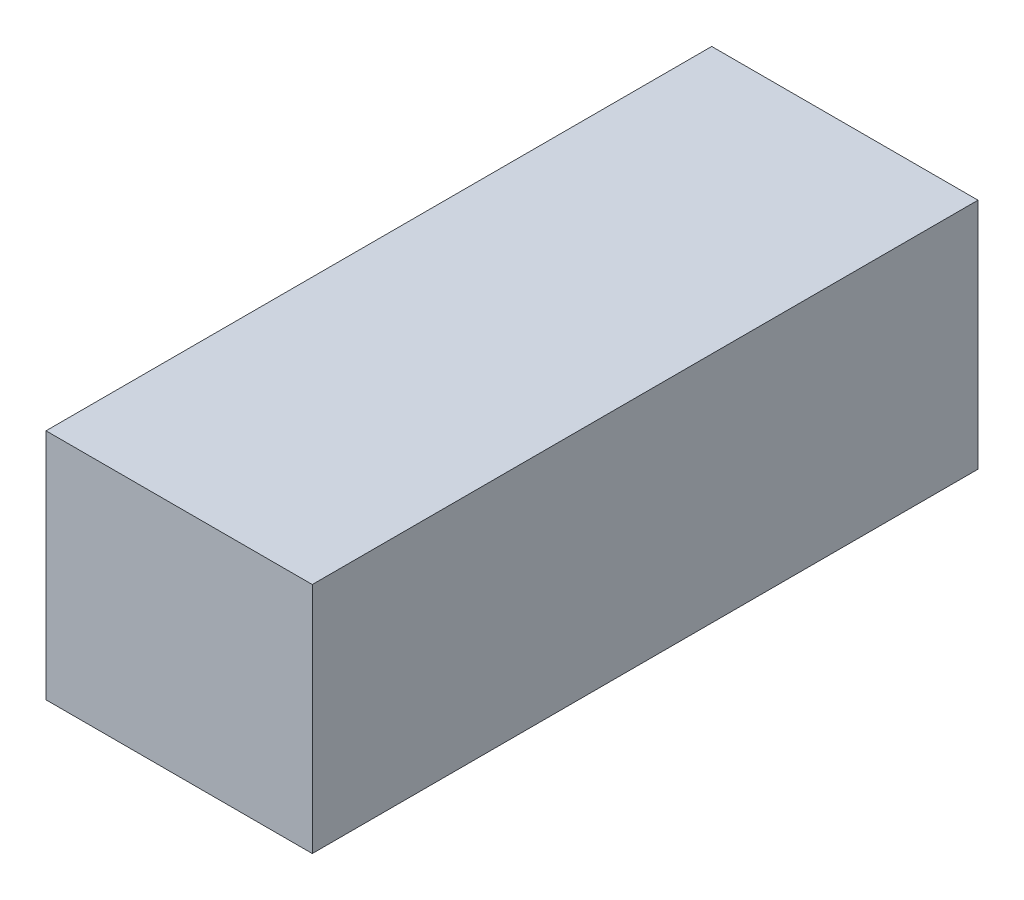
ISO-10303-21;
HEADER;
FILE_DESCRIPTION(('STEP AP214'),'2;1');
FILE_NAME('part.step','',(''),(''),'','','');
FILE_SCHEMA(('AUTOMOTIVE_DESIGN { 1 0 10303 214 1 1 1 1 }'));
ENDSEC;
DATA;
#1=APPLICATION_CONTEXT('core data for automotive mechanical design processes');
#2=APPLICATION_PROTOCOL_DEFINITION('international standard','automotive_design',2000,#1);
#3=PRODUCT_CONTEXT('',#1,'mechanical');
#4=PRODUCT('Part','Part','',(#3));
#5=PRODUCT_RELATED_PRODUCT_CATEGORY('part','',(#4));
#6=PRODUCT_DEFINITION_FORMATION('','',#4);
#7=PRODUCT_DEFINITION_CONTEXT('part definition',#1,'design');
#8=PRODUCT_DEFINITION('design','',#6,#7);
#9=PRODUCT_DEFINITION_SHAPE('','',#8);
#10=(LENGTH_UNIT() NAMED_UNIT(*) SI_UNIT(.MILLI.,.METRE.));
#11=(NAMED_UNIT(*) PLANE_ANGLE_UNIT() SI_UNIT($,.RADIAN.));
#12=(NAMED_UNIT(*) SI_UNIT($,.STERADIAN.) SOLID_ANGLE_UNIT());
#13=UNCERTAINTY_MEASURE_WITH_UNIT(LENGTH_MEASURE(1.E-05),#10,'distance_accuracy_value','');
#14=(GEOMETRIC_REPRESENTATION_CONTEXT(3) GLOBAL_UNCERTAINTY_ASSIGNED_CONTEXT((#13)) GLOBAL_UNIT_ASSIGNED_CONTEXT((#10,
#11,#12)) REPRESENTATION_CONTEXT('',''));
#15=CARTESIAN_POINT('',(0.,0.,0.));
#16=DIRECTION('',(0.,0.,1.));
#17=DIRECTION('',(1.,0.,0.));
#18=AXIS2_PLACEMENT_3D('',#15,#16,#17);
#19=CARTESIAN_POINT('',(2.,-1.75,10.));
#20=DIRECTION('',(-1.,0.,0.));
#21=DIRECTION('',(0.,0.,1.));
#22=AXIS2_PLACEMENT_3D('',#19,#20,#21);
#23=PLANE('',#22);
#24=DIRECTION('',(0.,1.,0.));
#25=VECTOR('',#24,1.);
#26=CARTESIAN_POINT('',(2.,-1.75,0.));
#27=LINE('',#26,#25);
#28=CARTESIAN_POINT('',(2.,-1.75,0.));
#29=VERTEX_POINT('',#28);
#30=CARTESIAN_POINT('',(2.,1.75,0.));
#31=VERTEX_POINT('',#30);
#32=EDGE_CURVE('E107',#29,#31,#27,.T.);
#33=ORIENTED_EDGE('',*,*,#32,.T.);
#34=DIRECTION('',(0.,0.,-1.));
#35=VECTOR('',#34,1.);
#36=CARTESIAN_POINT('',(2.,1.75,10.));
#37=LINE('',#36,#35);
#38=CARTESIAN_POINT('',(2.,1.75,10.));
#39=VERTEX_POINT('',#38);
#40=EDGE_CURVE('E11',#39,#31,#37,.T.);
#41=ORIENTED_EDGE('',*,*,#40,.F.);
#42=DIRECTION('',(0.,1.,0.));
#43=VECTOR('',#42,1.);
#44=CARTESIAN_POINT('',(2.,-1.75,10.));
#45=LINE('',#44,#43);
#46=CARTESIAN_POINT('',(2.,-1.75,10.));
#47=VERTEX_POINT('',#46);
#48=EDGE_CURVE('E91',#47,#39,#45,.T.);
#49=ORIENTED_EDGE('',*,*,#48,.F.);
#50=DIRECTION('',(0.,0.,-1.));
#51=VECTOR('',#50,1.);
#52=CARTESIAN_POINT('',(2.,-1.75,10.));
#53=LINE('',#52,#51);
#54=EDGE_CURVE('E103',#47,#29,#53,.T.);
#55=ORIENTED_EDGE('',*,*,#54,.T.);
#56=EDGE_LOOP('',(#33,#41,#49,#55));
#57=FACE_BOUND('',#56,.T.);
#58=ADVANCED_FACE('F39',(#57),#23,.F.);
#59=CARTESIAN_POINT('',(-2.,1.75,10.));
#60=DIRECTION('',(0.,-1.,0.));
#61=DIRECTION('',(0.,0.,-1.));
#62=AXIS2_PLACEMENT_3D('',#59,#60,#61);
#63=PLANE('',#62);
#64=DIRECTION('',(-1.,0.,0.));
#65=VECTOR('',#64,1.);
#66=CARTESIAN_POINT('',(-2.,1.75,0.));
#67=LINE('',#66,#65);
#68=CARTESIAN_POINT('',(-2.,1.75,0.));
#69=VERTEX_POINT('',#68);
#70=EDGE_CURVE('E96',#31,#69,#67,.T.);
#71=ORIENTED_EDGE('',*,*,#70,.T.);
#72=DIRECTION('',(0.,0.,-1.));
#73=VECTOR('',#72,1.);
#74=CARTESIAN_POINT('',(-2.,1.75,10.));
#75=LINE('',#74,#73);
#76=CARTESIAN_POINT('',(-2.,1.75,10.));
#77=VERTEX_POINT('',#76);
#78=EDGE_CURVE('E48',#77,#69,#75,.T.);
#79=ORIENTED_EDGE('',*,*,#78,.F.);
#80=DIRECTION('',(-1.,0.,0.));
#81=VECTOR('',#80,1.);
#82=CARTESIAN_POINT('',(-2.,1.75,10.));
#83=LINE('',#82,#81);
#84=EDGE_CURVE('E86',#39,#77,#83,.T.);
#85=ORIENTED_EDGE('',*,*,#84,.F.);
#86=ORIENTED_EDGE('',*,*,#40,.T.);
#87=EDGE_LOOP('',(#71,#79,#85,#86));
#88=FACE_BOUND('',#87,.T.);
#89=ADVANCED_FACE('F95',(#88),#63,.F.);
#90=CARTESIAN_POINT('',(-2.,-1.75,10.));
#91=DIRECTION('',(1.,0.,0.));
#92=DIRECTION('',(0.,0.,-1.));
#93=AXIS2_PLACEMENT_3D('',#90,#91,#92);
#94=PLANE('',#93);
#95=DIRECTION('',(0.,-1.,0.));
#96=VECTOR('',#95,1.);
#97=CARTESIAN_POINT('',(-2.,-1.75,0.));
#98=LINE('',#97,#96);
#99=CARTESIAN_POINT('',(-2.,-1.75,0.));
#100=VERTEX_POINT('',#99);
#101=EDGE_CURVE('E73',#69,#100,#98,.T.);
#102=ORIENTED_EDGE('',*,*,#101,.T.);
#103=DIRECTION('',(0.,0.,-1.));
#104=VECTOR('',#103,1.);
#105=CARTESIAN_POINT('',(-2.,-1.75,10.));
#106=LINE('',#105,#104);
#107=CARTESIAN_POINT('',(-2.,-1.75,10.));
#108=VERTEX_POINT('',#107);
#109=EDGE_CURVE('E98',#108,#100,#106,.T.);
#110=ORIENTED_EDGE('',*,*,#109,.F.);
#111=DIRECTION('',(0.,-1.,0.));
#112=VECTOR('',#111,1.);
#113=CARTESIAN_POINT('',(-2.,-1.75,10.));
#114=LINE('',#113,#112);
#115=EDGE_CURVE('E89',#77,#108,#114,.T.);
#116=ORIENTED_EDGE('',*,*,#115,.F.);
#117=ORIENTED_EDGE('',*,*,#78,.T.);
#118=EDGE_LOOP('',(#102,#110,#116,#117));
#119=FACE_BOUND('',#118,.T.);
#120=ADVANCED_FACE('F99',(#119),#94,.F.);
#121=CARTESIAN_POINT('',(-2.,-1.75,10.));
#122=DIRECTION('',(0.,1.,0.));
#123=DIRECTION('',(0.,0.,1.));
#124=AXIS2_PLACEMENT_3D('',#121,#122,#123);
#125=PLANE('',#124);
#126=DIRECTION('',(1.,0.,0.));
#127=VECTOR('',#126,1.);
#128=CARTESIAN_POINT('',(-2.,-1.75,0.));
#129=LINE('',#128,#127);
#130=EDGE_CURVE('E79',#100,#29,#129,.T.);
#131=ORIENTED_EDGE('',*,*,#130,.T.);
#132=ORIENTED_EDGE('',*,*,#54,.F.);
#133=DIRECTION('',(1.,0.,0.));
#134=VECTOR('',#133,1.);
#135=CARTESIAN_POINT('',(-2.,-1.75,10.));
#136=LINE('',#135,#134);
#137=EDGE_CURVE('E56',#108,#47,#136,.T.);
#138=ORIENTED_EDGE('',*,*,#137,.F.);
#139=ORIENTED_EDGE('',*,*,#109,.T.);
#140=EDGE_LOOP('',(#131,#132,#138,#139));
#141=FACE_BOUND('',#140,.T.);
#142=ADVANCED_FACE('F120',(#141),#125,.F.);
#143=CARTESIAN_POINT('',(0.,0.,10.));
#144=DIRECTION('',(0.,0.,-1.));
#145=DIRECTION('',(-1.,0.,0.));
#146=AXIS2_PLACEMENT_3D('',#143,#144,#145);
#147=PLANE('',#146);
#148=ORIENTED_EDGE('',*,*,#48,.T.);
#149=ORIENTED_EDGE('',*,*,#84,.T.);
#150=ORIENTED_EDGE('',*,*,#115,.T.);
#151=ORIENTED_EDGE('',*,*,#137,.T.);
#152=EDGE_LOOP('',(#148,#149,#150,#151));
#153=FACE_BOUND('',#152,.T.);
#154=ADVANCED_FACE('F87',(#153),#147,.F.);
#155=CARTESIAN_POINT('',(0.,0.,0.));
#156=DIRECTION('',(0.,0.,-1.));
#157=DIRECTION('',(-1.,0.,0.));
#158=AXIS2_PLACEMENT_3D('',#155,#156,#157);
#159=PLANE('',#158);
#160=ORIENTED_EDGE('',*,*,#32,.F.);
#161=ORIENTED_EDGE('',*,*,#130,.F.);
#162=ORIENTED_EDGE('',*,*,#101,.F.);
#163=ORIENTED_EDGE('',*,*,#70,.F.);
#164=EDGE_LOOP('',(#160,#161,#162,#163));
#165=FACE_BOUND('',#164,.T.);
#166=ADVANCED_FACE('F123',(#165),#159,.T.);
#167=CLOSED_SHELL('',(#58,#89,#120,#142,#154,#166));
#168=MANIFOLD_SOLID_BREP('B2',#167);
#169=ADVANCED_BREP_SHAPE_REPRESENTATION('',(#18,#168),#14);
#170=SHAPE_DEFINITION_REPRESENTATION(#9,#169);
ENDSEC;
END-ISO-10303-21;
